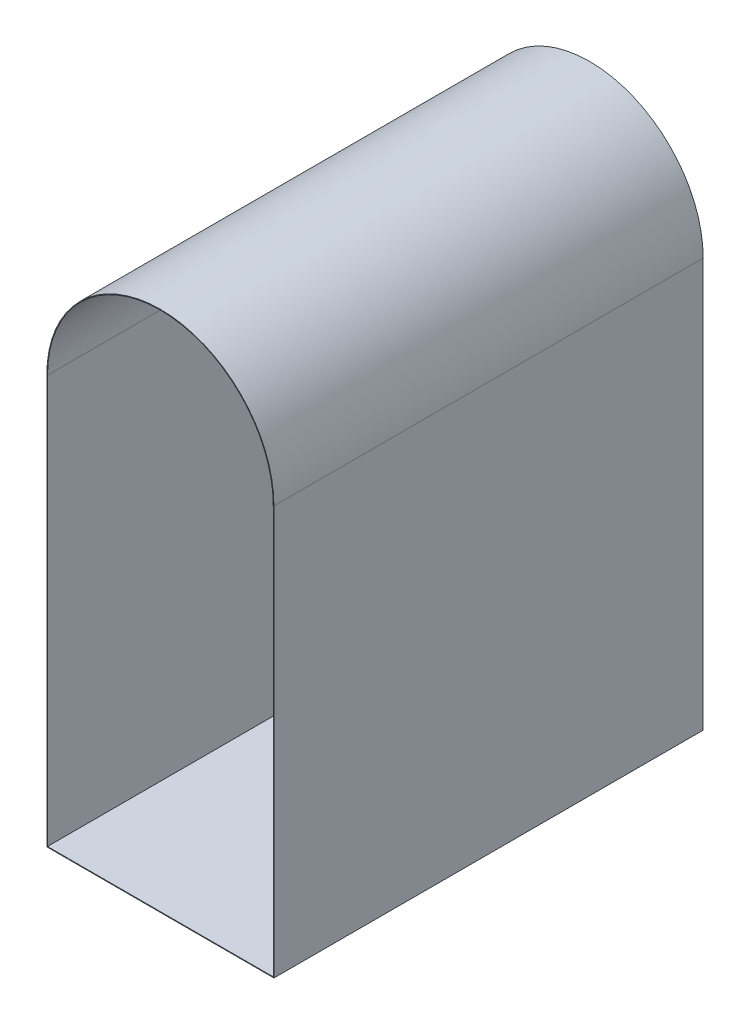
ISO-10303-21;
HEADER;
FILE_DESCRIPTION(('STEP AP214'),'2;1');
FILE_NAME('part.step','',(''),(''),'','','');
FILE_SCHEMA(('AUTOMOTIVE_DESIGN { 1 0 10303 214 1 1 1 1 }'));
ENDSEC;
DATA;
#1=APPLICATION_CONTEXT('core data for automotive mechanical design processes');
#2=APPLICATION_PROTOCOL_DEFINITION('international standard','automotive_design',2000,#1);
#3=PRODUCT_CONTEXT('',#1,'mechanical');
#4=PRODUCT('Part','Part','',(#3));
#5=PRODUCT_RELATED_PRODUCT_CATEGORY('part','',(#4));
#6=PRODUCT_DEFINITION_FORMATION('','',#4);
#7=PRODUCT_DEFINITION_CONTEXT('part definition',#1,'design');
#8=PRODUCT_DEFINITION('design','',#6,#7);
#9=PRODUCT_DEFINITION_SHAPE('','',#8);
#10=(LENGTH_UNIT() NAMED_UNIT(*) SI_UNIT(.MILLI.,.METRE.));
#11=(NAMED_UNIT(*) PLANE_ANGLE_UNIT() SI_UNIT($,.RADIAN.));
#12=(NAMED_UNIT(*) SI_UNIT($,.STERADIAN.) SOLID_ANGLE_UNIT());
#13=UNCERTAINTY_MEASURE_WITH_UNIT(LENGTH_MEASURE(1.E-05),#10,'distance_accuracy_value','');
#14=(GEOMETRIC_REPRESENTATION_CONTEXT(3) GLOBAL_UNCERTAINTY_ASSIGNED_CONTEXT((#13)) GLOBAL_UNIT_ASSIGNED_CONTEXT((#10,
#11,#12)) REPRESENTATION_CONTEXT('',''));
#15=CARTESIAN_POINT('',(0.,0.,0.));
#16=DIRECTION('',(0.,0.,1.));
#17=DIRECTION('',(1.,0.,0.));
#18=AXIS2_PLACEMENT_3D('',#15,#16,#17);
#19=CARTESIAN_POINT('',(0.,148.474727420565,189.));
#20=DIRECTION('',(0.,0.,-1.));
#21=DIRECTION('',(-1.,0.,0.));
#22=AXIS2_PLACEMENT_3D('',#19,#20,#21);
#23=PLANE('',#22);
#24=DIRECTION('',(0.,1.,0.));
#25=VECTOR('',#24,1.);
#26=CARTESIAN_POINT('',(50.,-31.5252725794353,189.));
#27=LINE('',#26,#25);
#28=CARTESIAN_POINT('',(50.,-31.5252725794353,189.));
#29=VERTEX_POINT('',#28);
#30=CARTESIAN_POINT('',(50.,148.474727420565,189.));
#31=VERTEX_POINT('',#30);
#32=EDGE_CURVE('E161',#29,#31,#27,.T.);
#33=ORIENTED_EDGE('',*,*,#32,.T.);
#34=CARTESIAN_POINT('',(0.,148.474727420565,189.));
#35=DIRECTION('',(0.,0.,1.));
#36=DIRECTION('',(-1.,0.,0.));
#37=AXIS2_PLACEMENT_3D('',#34,#35,#36);
#38=CIRCLE('',#37,50.);
#39=CARTESIAN_POINT('',(-50.0000000000001,148.474727420565,189.));
#40=VERTEX_POINT('',#39);
#41=EDGE_CURVE('E96',#31,#40,#38,.T.);
#42=ORIENTED_EDGE('',*,*,#41,.T.);
#43=DIRECTION('',(0.,-1.,0.));
#44=VECTOR('',#43,1.);
#45=CARTESIAN_POINT('',(-50.,-31.5252725794353,189.));
#46=LINE('',#45,#44);
#47=CARTESIAN_POINT('',(-50.,-31.5252725794353,189.));
#48=VERTEX_POINT('',#47);
#49=EDGE_CURVE('E166',#40,#48,#46,.T.);
#50=ORIENTED_EDGE('',*,*,#49,.T.);
#51=DIRECTION('',(1.,0.,0.));
#52=VECTOR('',#51,1.);
#53=CARTESIAN_POINT('',(-50.,-31.5252725794353,189.));
#54=LINE('',#53,#52);
#55=EDGE_CURVE('E68',#48,#29,#54,.T.);
#56=ORIENTED_EDGE('',*,*,#55,.T.);
#57=EDGE_LOOP('',(#33,#42,#50,#56));
#58=FACE_BOUND('',#57,.T.);
#59=DIRECTION('',(0.,1.,0.));
#60=VECTOR('',#59,1.);
#61=CARTESIAN_POINT('',(49.7,148.474727420565,189.));
#62=LINE('',#61,#60);
#63=CARTESIAN_POINT('',(49.7,-31.2252725794353,189.));
#64=VERTEX_POINT('',#63);
#65=CARTESIAN_POINT('',(49.7,148.474727420565,189.));
#66=VERTEX_POINT('',#65);
#67=EDGE_CURVE('E145',#64,#66,#62,.T.);
#68=ORIENTED_EDGE('',*,*,#67,.F.);
#69=DIRECTION('',(1.,0.,0.));
#70=VECTOR('',#69,1.);
#71=CARTESIAN_POINT('',(0.,-31.2252725794353,189.));
#72=LINE('',#71,#70);
#73=CARTESIAN_POINT('',(-49.7,-31.2252725794353,189.));
#74=VERTEX_POINT('',#73);
#75=EDGE_CURVE('E158',#74,#64,#72,.T.);
#76=ORIENTED_EDGE('',*,*,#75,.F.);
#77=DIRECTION('',(0.,-1.,0.));
#78=VECTOR('',#77,1.);
#79=CARTESIAN_POINT('',(-49.7000000000001,148.474727420565,189.));
#80=LINE('',#79,#78);
#81=CARTESIAN_POINT('',(-49.7000000000001,148.474727420565,189.));
#82=VERTEX_POINT('',#81);
#83=EDGE_CURVE('E155',#82,#74,#80,.T.);
#84=ORIENTED_EDGE('',*,*,#83,.F.);
#85=CARTESIAN_POINT('',(0.,148.474727420565,189.));
#86=DIRECTION('',(0.,0.,-1.));
#87=DIRECTION('',(-1.,0.,0.));
#88=AXIS2_PLACEMENT_3D('',#85,#86,#87);
#89=CIRCLE('',#88,49.7);
#90=EDGE_CURVE('E134',#66,#82,#89,.F.);
#91=ORIENTED_EDGE('',*,*,#90,.F.);
#92=EDGE_LOOP('',(#68,#76,#84,#91));
#93=FACE_BOUND('',#92,.T.);
#94=ADVANCED_FACE('F43',(#58,#93),#23,.F.);
#95=CARTESIAN_POINT('',(50.,-31.5252725794353,189.));
#96=DIRECTION('',(-1.,0.,0.));
#97=DIRECTION('',(0.,0.,1.));
#98=AXIS2_PLACEMENT_3D('',#95,#96,#97);
#99=PLANE('',#98);
#100=DIRECTION('',(0.,1.,0.));
#101=VECTOR('',#100,1.);
#102=CARTESIAN_POINT('',(50.,-31.5252725794353,0.));
#103=LINE('',#102,#101);
#104=CARTESIAN_POINT('',(50.,-31.5252725794353,0.));
#105=VERTEX_POINT('',#104);
#106=CARTESIAN_POINT('',(50.,148.474727420565,0.));
#107=VERTEX_POINT('',#106);
#108=EDGE_CURVE('E172',#105,#107,#103,.T.);
#109=ORIENTED_EDGE('',*,*,#108,.T.);
#110=DIRECTION('',(0.,0.,-1.));
#111=VECTOR('',#110,1.);
#112=CARTESIAN_POINT('',(50.,148.474727420565,189.));
#113=LINE('',#112,#111);
#114=EDGE_CURVE('E11',#31,#107,#113,.T.);
#115=ORIENTED_EDGE('',*,*,#114,.F.);
#116=ORIENTED_EDGE('',*,*,#32,.F.);
#117=DIRECTION('',(0.,0.,-1.));
#118=VECTOR('',#117,1.);
#119=CARTESIAN_POINT('',(50.,-31.5252725794353,189.));
#120=LINE('',#119,#118);
#121=EDGE_CURVE('E171',#29,#105,#120,.T.);
#122=ORIENTED_EDGE('',*,*,#121,.T.);
#123=EDGE_LOOP('',(#109,#115,#116,#122));
#124=FACE_BOUND('',#123,.T.);
#125=ADVANCED_FACE('F45',(#124),#99,.F.);
#126=CARTESIAN_POINT('',(0.,148.474727420565,189.));
#127=DIRECTION('',(0.,0.,-1.));
#128=DIRECTION('',(-1.,0.,0.));
#129=AXIS2_PLACEMENT_3D('',#126,#127,#128);
#130=CYLINDRICAL_SURFACE('',#129,50.);
#131=CARTESIAN_POINT('',(0.,148.474727420565,0.));
#132=DIRECTION('',(0.,0.,1.));
#133=DIRECTION('',(-1.,0.,0.));
#134=AXIS2_PLACEMENT_3D('',#131,#132,#133);
#135=CIRCLE('',#134,50.);
#136=CARTESIAN_POINT('',(-50.0000000000001,148.474727420565,0.));
#137=VERTEX_POINT('',#136);
#138=EDGE_CURVE('E176',#107,#137,#135,.T.);
#139=ORIENTED_EDGE('',*,*,#138,.T.);
#140=DIRECTION('',(0.,0.,-1.));
#141=VECTOR('',#140,1.);
#142=CARTESIAN_POINT('',(-50.0000000000001,148.474727420565,189.));
#143=LINE('',#142,#141);
#144=EDGE_CURVE('E52',#40,#137,#143,.T.);
#145=ORIENTED_EDGE('',*,*,#144,.F.);
#146=ORIENTED_EDGE('',*,*,#41,.F.);
#147=ORIENTED_EDGE('',*,*,#114,.T.);
#148=EDGE_LOOP('',(#139,#145,#146,#147));
#149=FACE_BOUND('',#148,.T.);
#150=ADVANCED_FACE('F210',(#149),#130,.T.);
#151=CARTESIAN_POINT('',(-50.,-31.5252725794353,189.));
#152=DIRECTION('',(1.,0.,0.));
#153=DIRECTION('',(0.,1.,0.));
#154=AXIS2_PLACEMENT_3D('',#151,#152,#153);
#155=PLANE('',#154);
#156=DIRECTION('',(0.,-1.,0.));
#157=VECTOR('',#156,1.);
#158=CARTESIAN_POINT('',(-50.,-31.5252725794353,0.));
#159=LINE('',#158,#157);
#160=CARTESIAN_POINT('',(-50.,-31.5252725794353,0.));
#161=VERTEX_POINT('',#160);
#162=EDGE_CURVE('E179',#137,#161,#159,.T.);
#163=ORIENTED_EDGE('',*,*,#162,.T.);
#164=DIRECTION('',(0.,0.,-1.));
#165=VECTOR('',#164,1.);
#166=CARTESIAN_POINT('',(-50.,-31.5252725794353,189.));
#167=LINE('',#166,#165);
#168=EDGE_CURVE('E186',#48,#161,#167,.T.);
#169=ORIENTED_EDGE('',*,*,#168,.F.);
#170=ORIENTED_EDGE('',*,*,#49,.F.);
#171=ORIENTED_EDGE('',*,*,#144,.T.);
#172=EDGE_LOOP('',(#163,#169,#170,#171));
#173=FACE_BOUND('',#172,.T.);
#174=ADVANCED_FACE('F193',(#173),#155,.F.);
#175=CARTESIAN_POINT('',(-50.,-31.5252725794353,189.));
#176=DIRECTION('',(0.,1.,0.));
#177=DIRECTION('',(-1.,0.,0.));
#178=AXIS2_PLACEMENT_3D('',#175,#176,#177);
#179=PLANE('',#178);
#180=DIRECTION('',(1.,0.,0.));
#181=VECTOR('',#180,1.);
#182=CARTESIAN_POINT('',(-50.,-31.5252725794353,0.));
#183=LINE('',#182,#181);
#184=EDGE_CURVE('E89',#161,#105,#183,.T.);
#185=ORIENTED_EDGE('',*,*,#184,.T.);
#186=ORIENTED_EDGE('',*,*,#121,.F.);
#187=ORIENTED_EDGE('',*,*,#55,.F.);
#188=ORIENTED_EDGE('',*,*,#168,.T.);
#189=EDGE_LOOP('',(#185,#186,#187,#188));
#190=FACE_BOUND('',#189,.T.);
#191=ADVANCED_FACE('F201',(#190),#179,.F.);
#192=CARTESIAN_POINT('',(0.,148.474727420565,0.));
#193=DIRECTION('',(0.,0.,-1.));
#194=DIRECTION('',(-1.,0.,0.));
#195=AXIS2_PLACEMENT_3D('',#192,#193,#194);
#196=PLANE('',#195);
#197=ORIENTED_EDGE('',*,*,#108,.F.);
#198=ORIENTED_EDGE('',*,*,#184,.F.);
#199=ORIENTED_EDGE('',*,*,#162,.F.);
#200=ORIENTED_EDGE('',*,*,#138,.F.);
#201=EDGE_LOOP('',(#197,#198,#199,#200));
#202=FACE_BOUND('',#201,.T.);
#203=ADVANCED_FACE('F197',(#202),#196,.T.);
#204=CARTESIAN_POINT('',(49.7,-31.5252725794353,189.));
#205=DIRECTION('',(-1.,0.,0.));
#206=DIRECTION('',(0.,0.,1.));
#207=AXIS2_PLACEMENT_3D('',#204,#205,#206);
#208=PLANE('',#207);
#209=DIRECTION('',(0.,1.,0.));
#210=VECTOR('',#209,1.);
#211=CARTESIAN_POINT('',(49.7,148.474727420565,0.3));
#212=LINE('',#211,#210);
#213=CARTESIAN_POINT('',(49.7,-31.2252725794353,0.3));
#214=VERTEX_POINT('',#213);
#215=CARTESIAN_POINT('',(49.7,148.474727420565,0.299999999999995));
#216=VERTEX_POINT('',#215);
#217=EDGE_CURVE('E124',#214,#216,#212,.T.);
#218=ORIENTED_EDGE('',*,*,#217,.F.);
#219=DIRECTION('',(0.,0.,-1.));
#220=VECTOR('',#219,1.);
#221=CARTESIAN_POINT('',(49.7,-31.2252725794353,189.));
#222=LINE('',#221,#220);
#223=EDGE_CURVE('E149',#64,#214,#222,.T.);
#224=ORIENTED_EDGE('',*,*,#223,.F.);
#225=ORIENTED_EDGE('',*,*,#67,.T.);
#226=DIRECTION('',(0.,0.,-1.));
#227=VECTOR('',#226,1.);
#228=CARTESIAN_POINT('',(49.7,148.474727420565,189.));
#229=LINE('',#228,#227);
#230=EDGE_CURVE('E138',#66,#216,#229,.T.);
#231=ORIENTED_EDGE('',*,*,#230,.T.);
#232=EDGE_LOOP('',(#218,#224,#225,#231));
#233=FACE_BOUND('',#232,.T.);
#234=ADVANCED_FACE('F208',(#233),#208,.T.);
#235=CARTESIAN_POINT('',(0.,148.474727420565,189.));
#236=DIRECTION('',(0.,0.,-1.));
#237=DIRECTION('',(-1.,0.,0.));
#238=AXIS2_PLACEMENT_3D('',#235,#236,#237);
#239=CYLINDRICAL_SURFACE('',#238,49.7);
#240=CARTESIAN_POINT('',(0.,148.474727420565,0.299999999999995));
#241=DIRECTION('',(0.,0.,-1.));
#242=DIRECTION('',(-1.,0.,0.));
#243=AXIS2_PLACEMENT_3D('',#240,#241,#242);
#244=CIRCLE('',#243,49.7);
#245=CARTESIAN_POINT('',(-49.7000000000001,148.474727420565,0.299999999999995));
#246=VERTEX_POINT('',#245);
#247=EDGE_CURVE('E118',#216,#246,#244,.F.);
#248=ORIENTED_EDGE('',*,*,#247,.F.);
#249=ORIENTED_EDGE('',*,*,#230,.F.);
#250=ORIENTED_EDGE('',*,*,#90,.T.);
#251=DIRECTION('',(0.,0.,1.));
#252=VECTOR('',#251,1.);
#253=CARTESIAN_POINT('',(-49.7000000000001,148.474727420565,189.));
#254=LINE('',#253,#252);
#255=EDGE_CURVE('E131',#82,#246,#254,.F.);
#256=ORIENTED_EDGE('',*,*,#255,.T.);
#257=EDGE_LOOP('',(#248,#249,#250,#256));
#258=FACE_BOUND('',#257,.T.);
#259=ADVANCED_FACE('F132',(#258),#239,.F.);
#260=CARTESIAN_POINT('',(-49.7,-31.5252725794353,189.));
#261=DIRECTION('',(1.,0.,0.));
#262=DIRECTION('',(0.,1.,0.));
#263=AXIS2_PLACEMENT_3D('',#260,#261,#262);
#264=PLANE('',#263);
#265=DIRECTION('',(0.,-1.,0.));
#266=VECTOR('',#265,1.);
#267=CARTESIAN_POINT('',(-49.7000000000001,148.474727420565,0.3));
#268=LINE('',#267,#266);
#269=CARTESIAN_POINT('',(-49.7,-31.2252725794353,0.3));
#270=VERTEX_POINT('',#269);
#271=EDGE_CURVE('E122',#246,#270,#268,.T.);
#272=ORIENTED_EDGE('',*,*,#271,.F.);
#273=ORIENTED_EDGE('',*,*,#255,.F.);
#274=ORIENTED_EDGE('',*,*,#83,.T.);
#275=DIRECTION('',(0.,0.,-1.));
#276=VECTOR('',#275,1.);
#277=CARTESIAN_POINT('',(-49.7,-31.2252725794353,189.));
#278=LINE('',#277,#276);
#279=EDGE_CURVE('E59',#74,#270,#278,.T.);
#280=ORIENTED_EDGE('',*,*,#279,.T.);
#281=EDGE_LOOP('',(#272,#273,#274,#280));
#282=FACE_BOUND('',#281,.T.);
#283=ADVANCED_FACE('F140',(#282),#264,.T.);
#284=CARTESIAN_POINT('',(-50.,-31.2252725794353,189.));
#285=DIRECTION('',(0.,1.,0.));
#286=DIRECTION('',(-1.,0.,0.));
#287=AXIS2_PLACEMENT_3D('',#284,#285,#286);
#288=PLANE('',#287);
#289=DIRECTION('',(1.,0.,0.));
#290=VECTOR('',#289,1.);
#291=CARTESIAN_POINT('',(0.,-31.2252725794353,0.3));
#292=LINE('',#291,#290);
#293=EDGE_CURVE('E142',#270,#214,#292,.T.);
#294=ORIENTED_EDGE('',*,*,#293,.F.);
#295=ORIENTED_EDGE('',*,*,#279,.F.);
#296=ORIENTED_EDGE('',*,*,#75,.T.);
#297=ORIENTED_EDGE('',*,*,#223,.T.);
#298=EDGE_LOOP('',(#294,#295,#296,#297));
#299=FACE_BOUND('',#298,.T.);
#300=ADVANCED_FACE('F221',(#299),#288,.T.);
#301=CARTESIAN_POINT('',(0.,148.474727420565,0.3));
#302=DIRECTION('',(0.,0.,-1.));
#303=DIRECTION('',(-1.,0.,0.));
#304=AXIS2_PLACEMENT_3D('',#301,#302,#303);
#305=PLANE('',#304);
#306=ORIENTED_EDGE('',*,*,#217,.T.);
#307=ORIENTED_EDGE('',*,*,#247,.T.);
#308=ORIENTED_EDGE('',*,*,#271,.T.);
#309=ORIENTED_EDGE('',*,*,#293,.T.);
#310=EDGE_LOOP('',(#306,#307,#308,#309));
#311=FACE_BOUND('',#310,.T.);
#312=ADVANCED_FACE('F120',(#311),#305,.F.);
#313=CLOSED_SHELL('',(#94,#125,#150,#174,#191,#203,#234,#259,#283,#300,#312));
#314=MANIFOLD_SOLID_BREP('B2',#313);
#315=ADVANCED_BREP_SHAPE_REPRESENTATION('',(#18,#314),#14);
#316=SHAPE_DEFINITION_REPRESENTATION(#9,#315);
ENDSEC;
END-ISO-10303-21;
